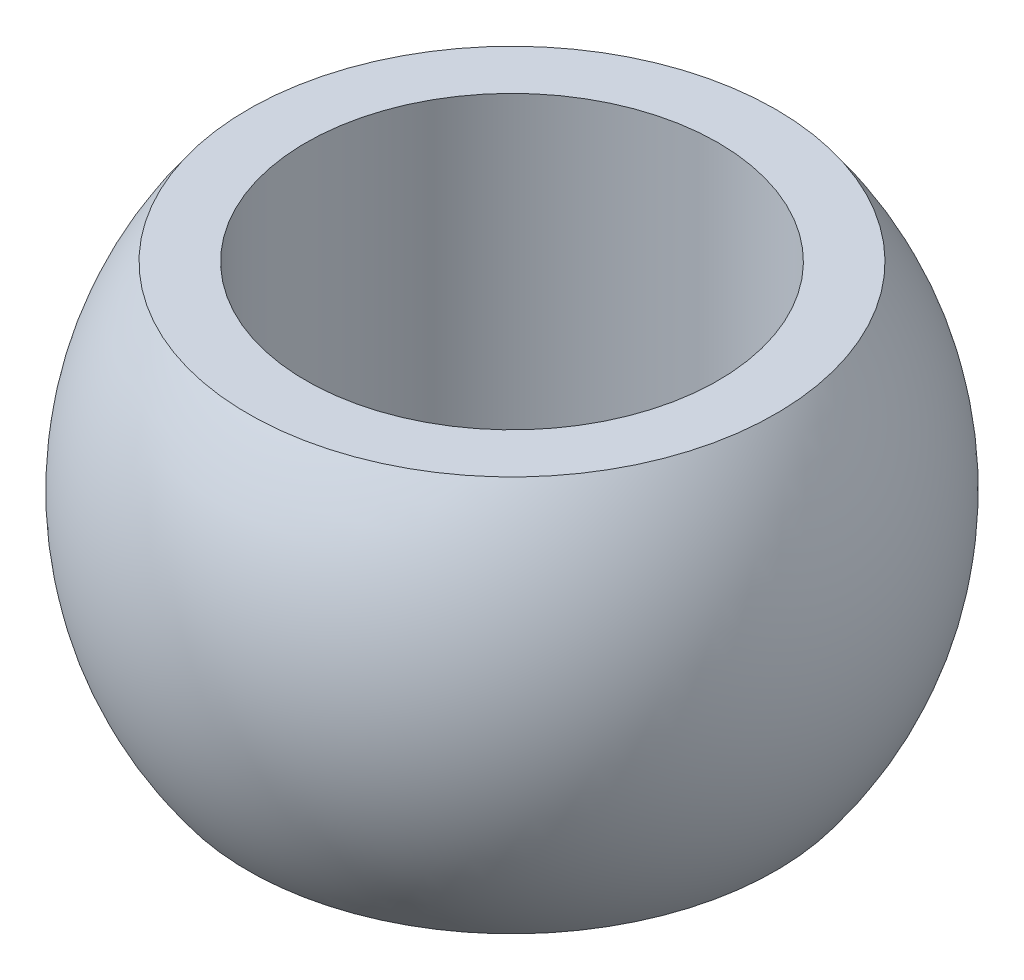
ISO-10303-21;
HEADER;
FILE_DESCRIPTION(('STEP AP214'),'2;1');
FILE_NAME('part.step','',(''),(''),'','','');
FILE_SCHEMA(('AUTOMOTIVE_DESIGN { 1 0 10303 214 1 1 1 1 }'));
ENDSEC;
DATA;
#1=APPLICATION_CONTEXT('core data for automotive mechanical design processes');
#2=APPLICATION_PROTOCOL_DEFINITION('international standard','automotive_design',2000,#1);
#3=PRODUCT_CONTEXT('',#1,'mechanical');
#4=PRODUCT('Part','Part','',(#3));
#5=PRODUCT_RELATED_PRODUCT_CATEGORY('part','',(#4));
#6=PRODUCT_DEFINITION_FORMATION('','',#4);
#7=PRODUCT_DEFINITION_CONTEXT('part definition',#1,'design');
#8=PRODUCT_DEFINITION('design','',#6,#7);
#9=PRODUCT_DEFINITION_SHAPE('','',#8);
#10=(LENGTH_UNIT() NAMED_UNIT(*) SI_UNIT(.MILLI.,.METRE.));
#11=(NAMED_UNIT(*) PLANE_ANGLE_UNIT() SI_UNIT($,.RADIAN.));
#12=(NAMED_UNIT(*) SI_UNIT($,.STERADIAN.) SOLID_ANGLE_UNIT());
#13=UNCERTAINTY_MEASURE_WITH_UNIT(LENGTH_MEASURE(1.E-05),#10,'distance_accuracy_value','');
#14=(GEOMETRIC_REPRESENTATION_CONTEXT(3) GLOBAL_UNCERTAINTY_ASSIGNED_CONTEXT((#13)) GLOBAL_UNIT_ASSIGNED_CONTEXT((#10,
#11,#12)) REPRESENTATION_CONTEXT('',''));
#15=CARTESIAN_POINT('',(0.,0.,0.));
#16=DIRECTION('',(0.,0.,1.));
#17=DIRECTION('',(1.,0.,0.));
#18=AXIS2_PLACEMENT_3D('',#15,#16,#17);
#19=CARTESIAN_POINT('',(0.,3.,0.));
#20=DIRECTION('',(0.,-1.,0.));
#21=DIRECTION('',(0.,0.,-1.));
#22=AXIS2_PLACEMENT_3D('',#19,#20,#21);
#23=PLANE('',#22);
#24=CARTESIAN_POINT('',(0.,3.,0.));
#25=DIRECTION('',(0.,-1.,0.));
#26=DIRECTION('',(0.,0.,-1.));
#27=AXIS2_PLACEMENT_3D('',#24,#25,#26);
#28=CIRCLE('',#27,3.125);
#29=CARTESIAN_POINT('',(0.,3.,-3.125));
#30=VERTEX_POINT('',#29);
#31=EDGE_CURVE('E41',#30,#30,#28,.T.);
#32=ORIENTED_EDGE('',*,*,#31,.T.);
#33=EDGE_LOOP('',(#32));
#34=FACE_BOUND('',#33,.T.);
#35=CARTESIAN_POINT('',(0.,3.,0.));
#36=DIRECTION('',(0.,1.,0.));
#37=DIRECTION('',(0.,0.,1.));
#38=AXIS2_PLACEMENT_3D('',#35,#36,#37);
#39=CIRCLE('',#38,4.);
#40=CARTESIAN_POINT('',(0.,3.,-4.));
#41=VERTEX_POINT('',#40);
#42=EDGE_CURVE('E37',#41,#41,#39,.T.);
#43=ORIENTED_EDGE('',*,*,#42,.T.);
#44=EDGE_LOOP('',(#43));
#45=FACE_BOUND('',#44,.T.);
#46=ADVANCED_FACE('F31',(#34,#45),#23,.F.);
#47=CARTESIAN_POINT('',(0.,-3.,0.));
#48=DIRECTION('',(0.,1.,0.));
#49=DIRECTION('',(0.,0.,1.));
#50=AXIS2_PLACEMENT_3D('',#47,#48,#49);
#51=PLANE('',#50);
#52=CARTESIAN_POINT('',(0.,-3.,0.));
#53=DIRECTION('',(0.,-1.,0.));
#54=DIRECTION('',(0.,0.,-1.));
#55=AXIS2_PLACEMENT_3D('',#52,#53,#54);
#56=CIRCLE('',#55,3.125);
#57=CARTESIAN_POINT('',(0.,-3.,-3.125));
#58=VERTEX_POINT('',#57);
#59=EDGE_CURVE('E45',#58,#58,#56,.T.);
#60=ORIENTED_EDGE('',*,*,#59,.F.);
#61=EDGE_LOOP('',(#60));
#62=FACE_BOUND('',#61,.T.);
#63=CARTESIAN_POINT('',(0.,-3.,0.));
#64=DIRECTION('',(0.,1.,0.));
#65=DIRECTION('',(0.,0.,1.));
#66=AXIS2_PLACEMENT_3D('',#63,#64,#65);
#67=CIRCLE('',#66,4.);
#68=CARTESIAN_POINT('',(0.,-3.,-4.));
#69=VERTEX_POINT('',#68);
#70=EDGE_CURVE('E10',#69,#69,#67,.T.);
#71=ORIENTED_EDGE('',*,*,#70,.F.);
#72=EDGE_LOOP('',(#71));
#73=FACE_BOUND('',#72,.T.);
#74=ADVANCED_FACE('F53',(#62,#73),#51,.F.);
#75=CARTESIAN_POINT('',(0.,0.,0.));
#76=DIRECTION('',(0.,1.,0.));
#77=DIRECTION('',(0.,0.,-1.));
#78=AXIS2_PLACEMENT_3D('',#75,#76,#77);
#79=SPHERICAL_SURFACE('',#78,5.);
#80=CARTESIAN_POINT('',(0.,3.,-4.));
#81=CARTESIAN_POINT('',(0.,2.94637535262417,-4.04021946351274));
#82=CARTESIAN_POINT('',(0.,2.89194105005646,-4.07935929588441));
#83=CARTESIAN_POINT('',(0.,2.7815431237906,-4.15541922749477));
#84=CARTESIAN_POINT('',(0.,2.72557950009246,-4.19233932673344));
#85=CARTESIAN_POINT('',(0.,2.61221292081908,-4.26389932122697));
#86=CARTESIAN_POINT('',(0.,2.55480996524386,-4.29853921648181));
#87=CARTESIAN_POINT('',(0.,2.43865770210434,-4.36548298196322));
#88=CARTESIAN_POINT('',(0.,2.37990839454004,-4.39778685218979));
#89=CARTESIAN_POINT('',(0.,2.26115840722921,-4.46000626695198));
#90=CARTESIAN_POINT('',(0.,2.20115772748266,-4.48992181148761));
#91=CARTESIAN_POINT('',(0.,2.08000204708613,-4.54731620599396));
#92=CARTESIAN_POINT('',(0.,2.01884704643614,-4.57479505596468));
#93=CARTESIAN_POINT('',(0.,1.89548162968563,-4.62727161491371));
#94=CARTESIAN_POINT('',(0.,1.83327121358511,-4.65226932389202));
#95=CARTESIAN_POINT('',(0.,1.70789558176357,-4.69974317222452));
#96=CARTESIAN_POINT('',(0.,1.64473036604255,-4.72221931157871));
#97=CARTESIAN_POINT('',(0.,1.51754729412584,-4.76461366892642));
#98=CARTESIAN_POINT('',(0.,1.45352943793015,-4.78453188691994));
#99=CARTESIAN_POINT('',(0.,1.32474462346084,-4.8217781871825));
#100=CARTESIAN_POINT('',(0.,1.25997766518723,-4.83910626945156));
#101=CARTESIAN_POINT('',(0.,1.1297993964424,-4.87114427292421));
#102=CARTESIAN_POINT('',(0.,1.06438808597119,-4.88585419412781));
#103=CARTESIAN_POINT('',(0.,0.933026904862732,-4.91263208459871));
#104=CARTESIAN_POINT('',(0.,0.867077034225481,-4.924700053866));
#105=CARTESIAN_POINT('',(0.,0.734745395844197,-4.94617452250896));
#106=CARTESIAN_POINT('',(0.,0.668363628100163,-4.95558102188463));
#107=CARTESIAN_POINT('',(0.,0.535275557088312,-4.97171733728031));
#108=CARTESIAN_POINT('',(0.,0.468569253820495,-4.97844715330032));
#109=CARTESIAN_POINT('',(0.,0.334939998226531,-4.98921921761493));
#110=CARTESIAN_POINT('',(0.,0.268017045900384,-4.99326146590952));
#111=CARTESIAN_POINT('',(0.,0.134062729049492,-4.99865185710206));
#112=CARTESIAN_POINT('',(0.,0.0670313645247472,-5.));
#113=CARTESIAN_POINT('',(0.,-0.0670313645247419,-5.));
#114=CARTESIAN_POINT('',(0.,-0.134062729049487,-4.99865185710206));
#115=CARTESIAN_POINT('',(0.,-0.268017045900379,-4.99326146590952));
#116=CARTESIAN_POINT('',(0.,-0.334939998226526,-4.98921921761493));
#117=CARTESIAN_POINT('',(0.,-0.46856925382049,-4.97844715330032));
#118=CARTESIAN_POINT('',(0.,-0.535275557088307,-4.97171733728031));
#119=CARTESIAN_POINT('',(0.,-0.668363628100158,-4.95558102188463));
#120=CARTESIAN_POINT('',(0.,-0.734745395844192,-4.94617452250896));
#121=CARTESIAN_POINT('',(0.,-0.867077034225476,-4.924700053866));
#122=CARTESIAN_POINT('',(0.,-0.933026904862727,-4.91263208459871));
#123=CARTESIAN_POINT('',(0.,-1.06438808597119,-4.88585419412781));
#124=CARTESIAN_POINT('',(0.,-1.1297993964424,-4.87114427292421));
#125=CARTESIAN_POINT('',(0.,-1.25997766518722,-4.83910626945156));
#126=CARTESIAN_POINT('',(0.,-1.32474462346084,-4.82177818718251));
#127=CARTESIAN_POINT('',(0.,-1.45352943793014,-4.78453188691994));
#128=CARTESIAN_POINT('',(0.,-1.51754729412583,-4.76461366892642));
#129=CARTESIAN_POINT('',(0.,-1.64473036604255,-4.72221931157872));
#130=CARTESIAN_POINT('',(0.,-1.70789558176357,-4.69974317222452));
#131=CARTESIAN_POINT('',(0.,-1.83327121358511,-4.65226932389202));
#132=CARTESIAN_POINT('',(0.,-1.89548162968563,-4.62727161491371));
#133=CARTESIAN_POINT('',(0.,-2.01884704643613,-4.57479505596468));
#134=CARTESIAN_POINT('',(0.,-2.08000204708612,-4.54731620599396));
#135=CARTESIAN_POINT('',(0.,-2.20115772748265,-4.48992181148761));
#136=CARTESIAN_POINT('',(0.,-2.2611584072292,-4.46000626695199));
#137=CARTESIAN_POINT('',(0.,-2.37990839454004,-4.39778685218979));
#138=CARTESIAN_POINT('',(0.,-2.43865770210433,-4.36548298196322));
#139=CARTESIAN_POINT('',(0.,-2.55480996524385,-4.29853921648181));
#140=CARTESIAN_POINT('',(0.,-2.61221292081908,-4.26389932122697));
#141=CARTESIAN_POINT('',(0.,-2.72557950009245,-4.19233932673345));
#142=CARTESIAN_POINT('',(0.,-2.7815431237906,-4.15541922749477));
#143=CARTESIAN_POINT('',(0.,-2.89194105005645,-4.07935929588442));
#144=CARTESIAN_POINT('',(0.,-2.94637535262417,-4.04021946351275));
#145=CARTESIAN_POINT('',(0.,-3.,-4.));
#146=B_SPLINE_CURVE_WITH_KNOTS('',3,(#80,#81,#82,#83,#84,#85,#86,#87,#88,#89,#90,#91,#92,#93,
#94,#95,#96,#97,#98,#99,#100,#101,#102,#103,#104,#105,#106,#107,#108,#109,#110,#111,#112,#113,
#114,#115,#116,#117,#118,#119,#120,#121,#122,#123,#124,#125,#126,#127,#128,#129,#130,#131,#132,
#133,#134,#135,#136,#137,#138,#139,#140,#141,#142,#143,#144,#145),.UNSPECIFIED.,.F.,.F.,(4,2,2,
2,2,2,2,2,2,2,2,2,2,2,2,2,2,2,2,2,2,2,2,2,2,2,2,2,2,2,2,2,4),(0.,0.201080543420077,
0.402161086840153,0.603241630260231,0.804322173680307,1.00540271710038,1.20648326052046,
1.40756380394054,1.60864434736062,1.80972489078069,2.01080543420077,2.21188597762085,
2.41296652104092,2.614047064461,2.81512760788108,3.01620815130115,3.21728869472123,
3.41836923814131,3.61944978156138,3.82053032498146,4.02161086840154,4.22269141182161,
4.42377195524169,4.62485249866177,4.82593304208184,5.02701358550192,5.228094128922,
5.42917467234207,5.63025521576215,5.83133575918223,6.03241630260231,6.23349684602238,
6.43457738944246),.UNSPECIFIED.);
#147=EDGE_CURVE('BSEAM56',#41,#69,#146,.T.);
#148=ORIENTED_EDGE('',*,*,#42,.F.);
#149=ORIENTED_EDGE('',*,*,#70,.T.);
#150=ORIENTED_EDGE('',*,*,#147,.T.);
#151=ORIENTED_EDGE('',*,*,#147,.F.);
#152=EDGE_LOOP('',(#148,#150,#149,#151));
#153=FACE_BOUND('',#152,.T.);
#154=ADVANCED_FACE('F56',(#153),#79,.T.);
#155=CARTESIAN_POINT('',(0.,3.,0.));
#156=DIRECTION('',(0.,-1.,0.));
#157=DIRECTION('',(0.,0.,-1.));
#158=AXIS2_PLACEMENT_3D('',#155,#156,#157);
#159=CYLINDRICAL_SURFACE('',#158,3.125);
#160=ORIENTED_EDGE('',*,*,#31,.F.);
#161=EDGE_LOOP('',(#160));
#162=FACE_BOUND('',#161,.T.);
#163=ORIENTED_EDGE('',*,*,#59,.T.);
#164=EDGE_LOOP('',(#163));
#165=FACE_BOUND('',#164,.T.);
#166=ADVANCED_FACE('F51',(#162,#165),#159,.F.);
#167=CLOSED_SHELL('',(#46,#74,#154,#166));
#168=MANIFOLD_SOLID_BREP('B2',#167);
#169=ADVANCED_BREP_SHAPE_REPRESENTATION('',(#18,#168),#14);
#170=SHAPE_DEFINITION_REPRESENTATION(#9,#169);
ENDSEC;
END-ISO-10303-21;
